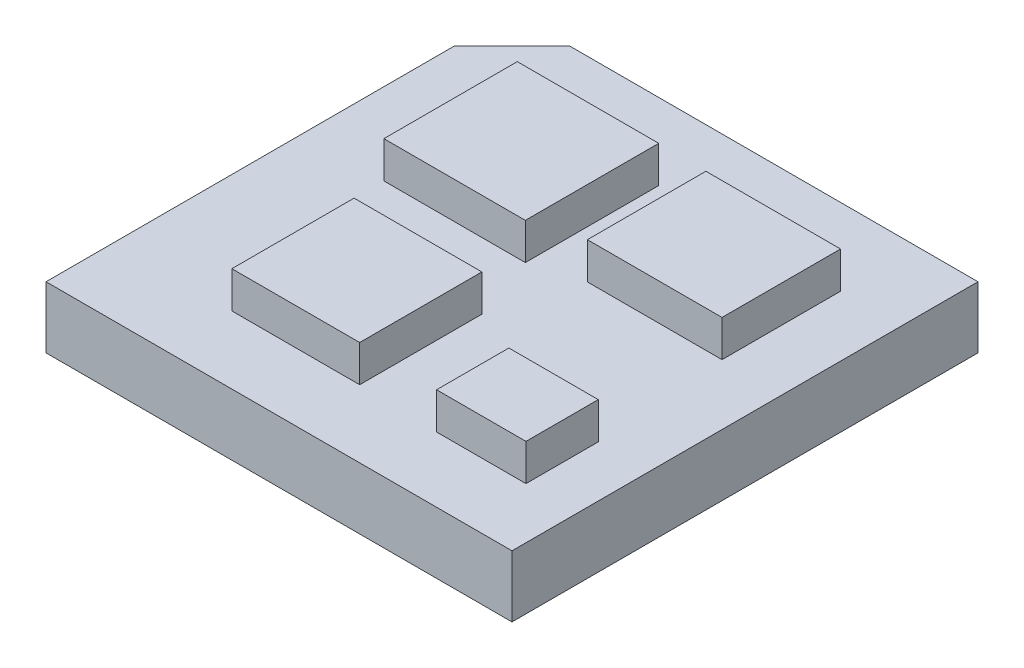
ISO-10303-21;
HEADER;
FILE_DESCRIPTION(('STEP AP214'),'2;1');
FILE_NAME('part.step','',(''),(''),'','','');
FILE_SCHEMA(('AUTOMOTIVE_DESIGN { 1 0 10303 214 1 1 1 1 }'));
ENDSEC;
DATA;
#1=APPLICATION_CONTEXT('core data for automotive mechanical design processes');
#2=APPLICATION_PROTOCOL_DEFINITION('international standard','automotive_design',2000,#1);
#3=PRODUCT_CONTEXT('',#1,'mechanical');
#4=PRODUCT('Part','Part','',(#3));
#5=PRODUCT_RELATED_PRODUCT_CATEGORY('part','',(#4));
#6=PRODUCT_DEFINITION_FORMATION('','',#4);
#7=PRODUCT_DEFINITION_CONTEXT('part definition',#1,'design');
#8=PRODUCT_DEFINITION('design','',#6,#7);
#9=PRODUCT_DEFINITION_SHAPE('','',#8);
#10=(LENGTH_UNIT() NAMED_UNIT(*) SI_UNIT(.MILLI.,.METRE.));
#11=(NAMED_UNIT(*) PLANE_ANGLE_UNIT() SI_UNIT($,.RADIAN.));
#12=(NAMED_UNIT(*) SI_UNIT($,.STERADIAN.) SOLID_ANGLE_UNIT());
#13=UNCERTAINTY_MEASURE_WITH_UNIT(LENGTH_MEASURE(1.E-05),#10,'distance_accuracy_value','');
#14=(GEOMETRIC_REPRESENTATION_CONTEXT(3) GLOBAL_UNCERTAINTY_ASSIGNED_CONTEXT((#13)) GLOBAL_UNIT_ASSIGNED_CONTEXT((#10,
#11,#12)) REPRESENTATION_CONTEXT('',''));
#15=CARTESIAN_POINT('',(0.,0.,0.));
#16=DIRECTION('',(0.,0.,1.));
#17=DIRECTION('',(1.,0.,0.));
#18=AXIS2_PLACEMENT_3D('',#15,#16,#17);
#19=CARTESIAN_POINT('',(0.,1.6,0.));
#20=DIRECTION('',(0.,-1.,0.));
#21=DIRECTION('',(0.,0.,-1.));
#22=AXIS2_PLACEMENT_3D('',#19,#20,#21);
#23=PLANE('',#22);
#24=DIRECTION('',(0.,0.,1.));
#25=VECTOR('',#24,1.);
#26=CARTESIAN_POINT('',(7.03277413815735,1.6,-10.1019294384684));
#27=LINE('',#26,#25);
#28=CARTESIAN_POINT('',(7.03277413815735,1.6,-10.1019294384684));
#29=VERTEX_POINT('',#28);
#30=CARTESIAN_POINT('',(7.03277413815735,1.6,-7.02471861243476));
#31=VERTEX_POINT('',#30);
#32=EDGE_CURVE('E196',#29,#31,#27,.T.);
#33=ORIENTED_EDGE('',*,*,#32,.F.);
#34=DIRECTION('',(-1.,0.,0.));
#35=VECTOR('',#34,1.);
#36=CARTESIAN_POINT('',(7.03277413815735,1.6,-10.1019294384684));
#37=LINE('',#36,#35);
#38=CARTESIAN_POINT('',(10.5288723017663,1.6,-10.1019294384684));
#39=VERTEX_POINT('',#38);
#40=EDGE_CURVE('E209',#39,#29,#37,.T.);
#41=ORIENTED_EDGE('',*,*,#40,.F.);
#42=DIRECTION('',(0.,0.,-1.));
#43=VECTOR('',#42,1.);
#44=CARTESIAN_POINT('',(10.5288723017663,1.6,-10.1019294384684));
#45=LINE('',#44,#43);
#46=CARTESIAN_POINT('',(10.5288723017663,1.6,-7.02471861243476));
#47=VERTEX_POINT('',#46);
#48=EDGE_CURVE('E218',#47,#39,#45,.T.);
#49=ORIENTED_EDGE('',*,*,#48,.F.);
#50=DIRECTION('',(1.,0.,0.));
#51=VECTOR('',#50,1.);
#52=CARTESIAN_POINT('',(7.03277413815735,1.6,-7.02471861243476));
#53=LINE('',#52,#51);
#54=EDGE_CURVE('E199',#31,#47,#53,.T.);
#55=ORIENTED_EDGE('',*,*,#54,.F.);
#56=EDGE_LOOP('',(#33,#41,#49,#55));
#57=FACE_BOUND('',#56,.T.);
#58=DIRECTION('',(0.,0.,1.));
#59=VECTOR('',#58,1.);
#60=CARTESIAN_POINT('',(2.11890344737059,1.6,-10.1180404899136));
#61=LINE('',#60,#59);
#62=CARTESIAN_POINT('',(2.11890344737059,1.6,-10.1180404899136));
#63=VERTEX_POINT('',#62);
#64=CARTESIAN_POINT('',(2.11890344737059,1.6,-6.6541644291951));
#65=VERTEX_POINT('',#64);
#66=EDGE_CURVE('E267',#63,#65,#61,.T.);
#67=ORIENTED_EDGE('',*,*,#66,.F.);
#68=DIRECTION('',(-1.,0.,0.));
#69=VECTOR('',#68,1.);
#70=CARTESIAN_POINT('',(2.11890344737059,1.6,-10.1180404899136));
#71=LINE('',#70,#69);
#72=CARTESIAN_POINT('',(5.79222317687676,1.6,-10.1180404899136));
#73=VERTEX_POINT('',#72);
#74=EDGE_CURVE('E272',#73,#63,#71,.T.);
#75=ORIENTED_EDGE('',*,*,#74,.F.);
#76=DIRECTION('',(0.,0.,-1.));
#77=VECTOR('',#76,1.);
#78=CARTESIAN_POINT('',(5.79222317687676,1.6,-10.1180404899136));
#79=LINE('',#78,#77);
#80=CARTESIAN_POINT('',(5.79222317687676,1.6,-6.6541644291951));
#81=VERTEX_POINT('',#80);
#82=EDGE_CURVE('E284',#81,#73,#79,.T.);
#83=ORIENTED_EDGE('',*,*,#82,.F.);
#84=DIRECTION('',(1.,0.,0.));
#85=VECTOR('',#84,1.);
#86=CARTESIAN_POINT('',(2.11890344737059,1.6,-6.6541644291951));
#87=LINE('',#86,#85);
#88=EDGE_CURVE('E281',#65,#81,#87,.T.);
#89=ORIENTED_EDGE('',*,*,#88,.F.);
#90=EDGE_LOOP('',(#67,#75,#83,#89));
#91=FACE_BOUND('',#90,.T.);
#92=DIRECTION('',(0.,0.,1.));
#93=VECTOR('',#92,1.);
#94=CARTESIAN_POINT('',(0.,1.6,0.));
#95=LINE('',#94,#93);
#96=CARTESIAN_POINT('',(0.,1.6,-10.6));
#97=VERTEX_POINT('',#96);
#98=CARTESIAN_POINT('',(0.,1.6,0.));
#99=VERTEX_POINT('',#98);
#100=EDGE_CURVE('E301',#97,#99,#95,.T.);
#101=ORIENTED_EDGE('',*,*,#100,.T.);
#102=DIRECTION('',(1.,0.,0.));
#103=VECTOR('',#102,1.);
#104=CARTESIAN_POINT('',(0.,1.6,0.));
#105=LINE('',#104,#103);
#106=CARTESIAN_POINT('',(12.1,1.6,0.));
#107=VERTEX_POINT('',#106);
#108=EDGE_CURVE('E304',#99,#107,#105,.T.);
#109=ORIENTED_EDGE('',*,*,#108,.T.);
#110=DIRECTION('',(0.,0.,-1.));
#111=VECTOR('',#110,1.);
#112=CARTESIAN_POINT('',(12.1,1.6,0.));
#113=LINE('',#112,#111);
#114=CARTESIAN_POINT('',(12.1,1.6,-12.1));
#115=VERTEX_POINT('',#114);
#116=EDGE_CURVE('E307',#107,#115,#113,.T.);
#117=ORIENTED_EDGE('',*,*,#116,.T.);
#118=DIRECTION('',(-1.,0.,0.));
#119=VECTOR('',#118,1.);
#120=CARTESIAN_POINT('',(1.5,1.6,-12.1));
#121=LINE('',#120,#119);
#122=CARTESIAN_POINT('',(1.5,1.6,-12.1));
#123=VERTEX_POINT('',#122);
#124=EDGE_CURVE('E309',#115,#123,#121,.T.);
#125=ORIENTED_EDGE('',*,*,#124,.T.);
#126=DIRECTION('',(-0.707106781186548,0.,0.707106781186548));
#127=VECTOR('',#126,1.);
#128=CARTESIAN_POINT('',(0.,1.6,-10.6));
#129=LINE('',#128,#127);
#130=EDGE_CURVE('E311',#123,#97,#129,.T.);
#131=ORIENTED_EDGE('',*,*,#130,.T.);
#132=EDGE_LOOP('',(#101,#109,#117,#125,#131));
#133=FACE_BOUND('',#132,.T.);
#134=DIRECTION('',(0.,0.,1.));
#135=VECTOR('',#134,1.);
#136=CARTESIAN_POINT('',(3.06945548263753,1.6,-4.93028192455843));
#137=LINE('',#136,#135);
#138=CARTESIAN_POINT('',(3.06945548263753,1.6,-4.93028192455843));
#139=VERTEX_POINT('',#138);
#140=CARTESIAN_POINT('',(3.06945548263753,1.6,-1.75640478985353));
#141=VERTEX_POINT('',#140);
#142=EDGE_CURVE('E234',#139,#141,#137,.T.);
#143=ORIENTED_EDGE('',*,*,#142,.F.);
#144=DIRECTION('',(-1.,0.,0.));
#145=VECTOR('',#144,1.);
#146=CARTESIAN_POINT('',(3.06945548263753,1.6,-4.93028192455843));
#147=LINE('',#146,#145);
#148=CARTESIAN_POINT('',(6.38833208034925,1.6,-4.93028192455843));
#149=VERTEX_POINT('',#148);
#150=EDGE_CURVE('E239',#149,#139,#147,.T.);
#151=ORIENTED_EDGE('',*,*,#150,.F.);
#152=DIRECTION('',(0.,0.,-1.));
#153=VECTOR('',#152,1.);
#154=CARTESIAN_POINT('',(6.38833208034925,1.6,-4.93028192455843));
#155=LINE('',#154,#153);
#156=CARTESIAN_POINT('',(6.38833208034925,1.6,-1.75640478985353));
#157=VERTEX_POINT('',#156);
#158=EDGE_CURVE('E251',#157,#149,#155,.T.);
#159=ORIENTED_EDGE('',*,*,#158,.F.);
#160=DIRECTION('',(1.,0.,0.));
#161=VECTOR('',#160,1.);
#162=CARTESIAN_POINT('',(3.06945548263753,1.6,-1.75640478985353));
#163=LINE('',#162,#161);
#164=EDGE_CURVE('E248',#141,#157,#163,.T.);
#165=ORIENTED_EDGE('',*,*,#164,.F.);
#166=EDGE_LOOP('',(#143,#151,#159,#165));
#167=FACE_BOUND('',#166,.T.);
#168=DIRECTION('',(0.,0.,1.));
#169=VECTOR('',#168,1.);
#170=CARTESIAN_POINT('',(8.44944836683226,1.6,-3.56959687638891));
#171=LINE('',#170,#169);
#172=CARTESIAN_POINT('',(8.44944836683226,1.6,-3.56959687638891));
#173=VERTEX_POINT('',#172);
#174=CARTESIAN_POINT('',(8.44944836683226,1.6,-1.69196058407272));
#175=VERTEX_POINT('',#174);
#176=EDGE_CURVE('E195',#173,#175,#171,.T.);
#177=ORIENTED_EDGE('',*,*,#176,.F.);
#178=DIRECTION('',(-1.,0.,0.));
#179=VECTOR('',#178,1.);
#180=CARTESIAN_POINT('',(8.44944836683226,1.6,-3.56959687638891));
#181=LINE('',#180,#179);
#182=CARTESIAN_POINT('',(10.7705380734443,1.6,-3.56959687638891));
#183=VERTEX_POINT('',#182);
#184=EDGE_CURVE('E192',#183,#173,#181,.T.);
#185=ORIENTED_EDGE('',*,*,#184,.F.);
#186=DIRECTION('',(0.,0.,-1.));
#187=VECTOR('',#186,1.);
#188=CARTESIAN_POINT('',(10.7705380734443,1.6,-3.56959687638891));
#189=LINE('',#188,#187);
#190=CARTESIAN_POINT('',(10.7705380734443,1.6,-1.69196058407272));
#191=VERTEX_POINT('',#190);
#192=EDGE_CURVE('E52',#191,#183,#189,.T.);
#193=ORIENTED_EDGE('',*,*,#192,.F.);
#194=DIRECTION('',(1.,0.,0.));
#195=VECTOR('',#194,1.);
#196=CARTESIAN_POINT('',(8.44944836683226,1.6,-1.69196058407272));
#197=LINE('',#196,#195);
#198=EDGE_CURVE('E47',#175,#191,#197,.T.);
#199=ORIENTED_EDGE('',*,*,#198,.F.);
#200=EDGE_LOOP('',(#177,#185,#193,#199));
#201=FACE_BOUND('',#200,.T.);
#202=ADVANCED_FACE('F32',(#57,#91,#133,#167,#201),#23,.F.);
#203=CARTESIAN_POINT('',(0.,1.6,0.));
#204=DIRECTION('',(1.,0.,0.));
#205=DIRECTION('',(0.,0.,-1.));
#206=AXIS2_PLACEMENT_3D('',#203,#204,#205);
#207=PLANE('',#206);
#208=DIRECTION('',(0.,0.,1.));
#209=VECTOR('',#208,1.);
#210=CARTESIAN_POINT('',(0.,0.,0.));
#211=LINE('',#210,#209);
#212=CARTESIAN_POINT('',(0.,0.,-10.6));
#213=VERTEX_POINT('',#212);
#214=CARTESIAN_POINT('',(0.,0.,0.));
#215=VERTEX_POINT('',#214);
#216=EDGE_CURVE('E300',#213,#215,#211,.T.);
#217=ORIENTED_EDGE('',*,*,#216,.T.);
#218=DIRECTION('',(0.,-1.,0.));
#219=VECTOR('',#218,1.);
#220=CARTESIAN_POINT('',(0.,1.6,0.));
#221=LINE('',#220,#219);
#222=EDGE_CURVE('E11',#99,#215,#221,.T.);
#223=ORIENTED_EDGE('',*,*,#222,.F.);
#224=ORIENTED_EDGE('',*,*,#100,.F.);
#225=DIRECTION('',(0.,-1.,0.));
#226=VECTOR('',#225,1.);
#227=CARTESIAN_POINT('',(0.,1.6,-10.6));
#228=LINE('',#227,#226);
#229=EDGE_CURVE('E313',#97,#213,#228,.T.);
#230=ORIENTED_EDGE('',*,*,#229,.T.);
#231=EDGE_LOOP('',(#217,#223,#224,#230));
#232=FACE_BOUND('',#231,.T.);
#233=ADVANCED_FACE('F34',(#232),#207,.F.);
#234=CARTESIAN_POINT('',(0.,1.6,0.));
#235=DIRECTION('',(0.,0.,-1.));
#236=DIRECTION('',(-1.,0.,0.));
#237=AXIS2_PLACEMENT_3D('',#234,#235,#236);
#238=PLANE('',#237);
#239=DIRECTION('',(1.,0.,0.));
#240=VECTOR('',#239,1.);
#241=CARTESIAN_POINT('',(0.,0.,0.));
#242=LINE('',#241,#240);
#243=CARTESIAN_POINT('',(12.1,0.,0.));
#244=VERTEX_POINT('',#243);
#245=EDGE_CURVE('E316',#215,#244,#242,.T.);
#246=ORIENTED_EDGE('',*,*,#245,.T.);
#247=DIRECTION('',(0.,-1.,0.));
#248=VECTOR('',#247,1.);
#249=CARTESIAN_POINT('',(12.1,1.6,0.));
#250=LINE('',#249,#248);
#251=EDGE_CURVE('E40',#107,#244,#250,.T.);
#252=ORIENTED_EDGE('',*,*,#251,.F.);
#253=ORIENTED_EDGE('',*,*,#108,.F.);
#254=ORIENTED_EDGE('',*,*,#222,.T.);
#255=EDGE_LOOP('',(#246,#252,#253,#254));
#256=FACE_BOUND('',#255,.T.);
#257=ADVANCED_FACE('F355',(#256),#238,.F.);
#258=CARTESIAN_POINT('',(12.1,1.6,0.));
#259=DIRECTION('',(-1.,0.,0.));
#260=DIRECTION('',(0.,0.,1.));
#261=AXIS2_PLACEMENT_3D('',#258,#259,#260);
#262=PLANE('',#261);
#263=DIRECTION('',(0.,0.,-1.));
#264=VECTOR('',#263,1.);
#265=CARTESIAN_POINT('',(12.1,0.,0.));
#266=LINE('',#265,#264);
#267=CARTESIAN_POINT('',(12.1,0.,-12.1));
#268=VERTEX_POINT('',#267);
#269=EDGE_CURVE('E318',#244,#268,#266,.T.);
#270=ORIENTED_EDGE('',*,*,#269,.T.);
#271=DIRECTION('',(0.,-1.,0.));
#272=VECTOR('',#271,1.);
#273=CARTESIAN_POINT('',(12.1,1.6,-12.1));
#274=LINE('',#273,#272);
#275=EDGE_CURVE('E328',#115,#268,#274,.T.);
#276=ORIENTED_EDGE('',*,*,#275,.F.);
#277=ORIENTED_EDGE('',*,*,#116,.F.);
#278=ORIENTED_EDGE('',*,*,#251,.T.);
#279=EDGE_LOOP('',(#270,#276,#277,#278));
#280=FACE_BOUND('',#279,.T.);
#281=ADVANCED_FACE('F335',(#280),#262,.F.);
#282=CARTESIAN_POINT('',(1.5,1.6,-12.1));
#283=DIRECTION('',(0.,0.,1.));
#284=DIRECTION('',(1.,0.,0.));
#285=AXIS2_PLACEMENT_3D('',#282,#283,#284);
#286=PLANE('',#285);
#287=DIRECTION('',(-1.,0.,0.));
#288=VECTOR('',#287,1.);
#289=CARTESIAN_POINT('',(1.5,0.,-12.1));
#290=LINE('',#289,#288);
#291=CARTESIAN_POINT('',(1.5,0.,-12.1));
#292=VERTEX_POINT('',#291);
#293=EDGE_CURVE('E320',#268,#292,#290,.T.);
#294=ORIENTED_EDGE('',*,*,#293,.T.);
#295=DIRECTION('',(0.,-1.,0.));
#296=VECTOR('',#295,1.);
#297=CARTESIAN_POINT('',(1.5,1.6,-12.1));
#298=LINE('',#297,#296);
#299=EDGE_CURVE('E325',#123,#292,#298,.T.);
#300=ORIENTED_EDGE('',*,*,#299,.F.);
#301=ORIENTED_EDGE('',*,*,#124,.F.);
#302=ORIENTED_EDGE('',*,*,#275,.T.);
#303=EDGE_LOOP('',(#294,#300,#301,#302));
#304=FACE_BOUND('',#303,.T.);
#305=ADVANCED_FACE('F345',(#304),#286,.F.);
#306=CARTESIAN_POINT('',(0.,1.6,-10.6));
#307=DIRECTION('',(0.707106781186548,0.,0.707106781186548));
#308=DIRECTION('',(0.707106781186548,0.,-0.707106781186548));
#309=AXIS2_PLACEMENT_3D('',#306,#307,#308);
#310=PLANE('',#309);
#311=DIRECTION('',(-0.707106781186548,0.,0.707106781186548));
#312=VECTOR('',#311,1.);
#313=CARTESIAN_POINT('',(0.,0.,-10.6));
#314=LINE('',#313,#312);
#315=EDGE_CURVE('E305',#292,#213,#314,.T.);
#316=ORIENTED_EDGE('',*,*,#315,.T.);
#317=ORIENTED_EDGE('',*,*,#229,.F.);
#318=ORIENTED_EDGE('',*,*,#130,.F.);
#319=ORIENTED_EDGE('',*,*,#299,.T.);
#320=EDGE_LOOP('',(#316,#317,#318,#319));
#321=FACE_BOUND('',#320,.T.);
#322=ADVANCED_FACE('F349',(#321),#310,.F.);
#323=CARTESIAN_POINT('',(0.,0.,0.));
#324=DIRECTION('',(0.,-1.,0.));
#325=DIRECTION('',(0.,0.,-1.));
#326=AXIS2_PLACEMENT_3D('',#323,#324,#325);
#327=PLANE('',#326);
#328=ORIENTED_EDGE('',*,*,#216,.F.);
#329=ORIENTED_EDGE('',*,*,#315,.F.);
#330=ORIENTED_EDGE('',*,*,#293,.F.);
#331=ORIENTED_EDGE('',*,*,#269,.F.);
#332=ORIENTED_EDGE('',*,*,#245,.F.);
#333=EDGE_LOOP('',(#328,#329,#330,#331,#332));
#334=FACE_BOUND('',#333,.T.);
#335=ADVANCED_FACE('F341',(#334),#327,.T.);
#336=CARTESIAN_POINT('',(2.11890344737059,2.55,-10.1180404899136));
#337=DIRECTION('',(1.,0.,0.));
#338=DIRECTION('',(0.,0.,-1.));
#339=AXIS2_PLACEMENT_3D('',#336,#337,#338);
#340=PLANE('',#339);
#341=ORIENTED_EDGE('',*,*,#66,.T.);
#342=DIRECTION('',(0.,-1.,0.));
#343=VECTOR('',#342,1.);
#344=CARTESIAN_POINT('',(2.11890344737059,2.55,-6.6541644291951));
#345=LINE('',#344,#343);
#346=CARTESIAN_POINT('',(2.11890344737059,2.55,-6.6541644291951));
#347=VERTEX_POINT('',#346);
#348=EDGE_CURVE('E297',#347,#65,#345,.T.);
#349=ORIENTED_EDGE('',*,*,#348,.F.);
#350=DIRECTION('',(0.,0.,1.));
#351=VECTOR('',#350,1.);
#352=CARTESIAN_POINT('',(2.11890344737059,2.55,-10.1180404899136));
#353=LINE('',#352,#351);
#354=CARTESIAN_POINT('',(2.11890344737059,2.55,-10.1180404899136));
#355=VERTEX_POINT('',#354);
#356=EDGE_CURVE('E268',#355,#347,#353,.T.);
#357=ORIENTED_EDGE('',*,*,#356,.F.);
#358=DIRECTION('',(0.,-1.,0.));
#359=VECTOR('',#358,1.);
#360=CARTESIAN_POINT('',(2.11890344737059,2.55,-10.1180404899136));
#361=LINE('',#360,#359);
#362=EDGE_CURVE('E278',#355,#63,#361,.T.);
#363=ORIENTED_EDGE('',*,*,#362,.T.);
#364=EDGE_LOOP('',(#341,#349,#357,#363));
#365=FACE_BOUND('',#364,.T.);
#366=ADVANCED_FACE('F369',(#365),#340,.F.);
#367=CARTESIAN_POINT('',(2.11890344737059,2.55,-6.6541644291951));
#368=DIRECTION('',(0.,0.,-1.));
#369=DIRECTION('',(-1.,0.,0.));
#370=AXIS2_PLACEMENT_3D('',#367,#368,#369);
#371=PLANE('',#370);
#372=ORIENTED_EDGE('',*,*,#88,.T.);
#373=DIRECTION('',(0.,-1.,0.));
#374=VECTOR('',#373,1.);
#375=CARTESIAN_POINT('',(5.79222317687676,2.55,-6.6541644291951));
#376=LINE('',#375,#374);
#377=CARTESIAN_POINT('',(5.79222317687676,2.55,-6.6541644291951));
#378=VERTEX_POINT('',#377);
#379=EDGE_CURVE('E294',#378,#81,#376,.T.);
#380=ORIENTED_EDGE('',*,*,#379,.F.);
#381=DIRECTION('',(1.,0.,0.));
#382=VECTOR('',#381,1.);
#383=CARTESIAN_POINT('',(2.11890344737059,2.55,-6.6541644291951));
#384=LINE('',#383,#382);
#385=EDGE_CURVE('E271',#347,#378,#384,.T.);
#386=ORIENTED_EDGE('',*,*,#385,.F.);
#387=ORIENTED_EDGE('',*,*,#348,.T.);
#388=EDGE_LOOP('',(#372,#380,#386,#387));
#389=FACE_BOUND('',#388,.T.);
#390=ADVANCED_FACE('F400',(#389),#371,.F.);
#391=CARTESIAN_POINT('',(5.79222317687676,2.55,-10.1180404899136));
#392=DIRECTION('',(-1.,0.,0.));
#393=DIRECTION('',(0.,0.,1.));
#394=AXIS2_PLACEMENT_3D('',#391,#392,#393);
#395=PLANE('',#394);
#396=ORIENTED_EDGE('',*,*,#82,.T.);
#397=DIRECTION('',(0.,-1.,0.));
#398=VECTOR('',#397,1.);
#399=CARTESIAN_POINT('',(5.79222317687676,2.55,-10.1180404899136));
#400=LINE('',#399,#398);
#401=CARTESIAN_POINT('',(5.79222317687676,2.55,-10.1180404899136));
#402=VERTEX_POINT('',#401);
#403=EDGE_CURVE('E291',#402,#73,#400,.T.);
#404=ORIENTED_EDGE('',*,*,#403,.F.);
#405=DIRECTION('',(0.,0.,-1.));
#406=VECTOR('',#405,1.);
#407=CARTESIAN_POINT('',(5.79222317687676,2.55,-10.1180404899136));
#408=LINE('',#407,#406);
#409=EDGE_CURVE('E274',#378,#402,#408,.T.);
#410=ORIENTED_EDGE('',*,*,#409,.F.);
#411=ORIENTED_EDGE('',*,*,#379,.T.);
#412=EDGE_LOOP('',(#396,#404,#410,#411));
#413=FACE_BOUND('',#412,.T.);
#414=ADVANCED_FACE('F407',(#413),#395,.F.);
#415=CARTESIAN_POINT('',(2.11890344737059,2.55,-10.1180404899136));
#416=DIRECTION('',(0.,0.,1.));
#417=DIRECTION('',(1.,0.,0.));
#418=AXIS2_PLACEMENT_3D('',#415,#416,#417);
#419=PLANE('',#418);
#420=ORIENTED_EDGE('',*,*,#74,.T.);
#421=ORIENTED_EDGE('',*,*,#362,.F.);
#422=DIRECTION('',(-1.,0.,0.));
#423=VECTOR('',#422,1.);
#424=CARTESIAN_POINT('',(2.11890344737059,2.55,-10.1180404899136));
#425=LINE('',#424,#423);
#426=EDGE_CURVE('E276',#402,#355,#425,.T.);
#427=ORIENTED_EDGE('',*,*,#426,.F.);
#428=ORIENTED_EDGE('',*,*,#403,.T.);
#429=EDGE_LOOP('',(#420,#421,#427,#428));
#430=FACE_BOUND('',#429,.T.);
#431=ADVANCED_FACE('F414',(#430),#419,.F.);
#432=CARTESIAN_POINT('',(0.,2.55,0.));
#433=DIRECTION('',(0.,1.,0.));
#434=DIRECTION('',(0.,0.,1.));
#435=AXIS2_PLACEMENT_3D('',#432,#433,#434);
#436=PLANE('',#435);
#437=ORIENTED_EDGE('',*,*,#356,.T.);
#438=ORIENTED_EDGE('',*,*,#385,.T.);
#439=ORIENTED_EDGE('',*,*,#409,.T.);
#440=ORIENTED_EDGE('',*,*,#426,.T.);
#441=EDGE_LOOP('',(#437,#438,#439,#440));
#442=FACE_BOUND('',#441,.T.);
#443=ADVANCED_FACE('F422',(#442),#436,.T.);
#444=CARTESIAN_POINT('',(3.06945548263753,2.55,-4.93028192455843));
#445=DIRECTION('',(1.,0.,0.));
#446=DIRECTION('',(0.,0.,-1.));
#447=AXIS2_PLACEMENT_3D('',#444,#445,#446);
#448=PLANE('',#447);
#449=ORIENTED_EDGE('',*,*,#142,.T.);
#450=DIRECTION('',(0.,-1.,0.));
#451=VECTOR('',#450,1.);
#452=CARTESIAN_POINT('',(3.06945548263753,2.55,-1.75640478985353));
#453=LINE('',#452,#451);
#454=CARTESIAN_POINT('',(3.06945548263753,2.55,-1.75640478985353));
#455=VERTEX_POINT('',#454);
#456=EDGE_CURVE('E264',#455,#141,#453,.T.);
#457=ORIENTED_EDGE('',*,*,#456,.F.);
#458=DIRECTION('',(0.,0.,1.));
#459=VECTOR('',#458,1.);
#460=CARTESIAN_POINT('',(3.06945548263753,2.55,-4.93028192455843));
#461=LINE('',#460,#459);
#462=CARTESIAN_POINT('',(3.06945548263753,2.55,-4.93028192455843));
#463=VERTEX_POINT('',#462);
#464=EDGE_CURVE('E235',#463,#455,#461,.T.);
#465=ORIENTED_EDGE('',*,*,#464,.F.);
#466=DIRECTION('',(0.,-1.,0.));
#467=VECTOR('',#466,1.);
#468=CARTESIAN_POINT('',(3.06945548263753,2.55,-4.93028192455843));
#469=LINE('',#468,#467);
#470=EDGE_CURVE('E245',#463,#139,#469,.T.);
#471=ORIENTED_EDGE('',*,*,#470,.T.);
#472=EDGE_LOOP('',(#449,#457,#465,#471));
#473=FACE_BOUND('',#472,.T.);
#474=ADVANCED_FACE('F430',(#473),#448,.F.);
#475=CARTESIAN_POINT('',(3.06945548263753,2.55,-1.75640478985353));
#476=DIRECTION('',(0.,0.,-1.));
#477=DIRECTION('',(-1.,0.,0.));
#478=AXIS2_PLACEMENT_3D('',#475,#476,#477);
#479=PLANE('',#478);
#480=ORIENTED_EDGE('',*,*,#164,.T.);
#481=DIRECTION('',(0.,-1.,0.));
#482=VECTOR('',#481,1.);
#483=CARTESIAN_POINT('',(6.38833208034925,2.55,-1.75640478985353));
#484=LINE('',#483,#482);
#485=CARTESIAN_POINT('',(6.38833208034925,2.55,-1.75640478985353));
#486=VERTEX_POINT('',#485);
#487=EDGE_CURVE('E261',#486,#157,#484,.T.);
#488=ORIENTED_EDGE('',*,*,#487,.F.);
#489=DIRECTION('',(1.,0.,0.));
#490=VECTOR('',#489,1.);
#491=CARTESIAN_POINT('',(3.06945548263753,2.55,-1.75640478985353));
#492=LINE('',#491,#490);
#493=EDGE_CURVE('E238',#455,#486,#492,.T.);
#494=ORIENTED_EDGE('',*,*,#493,.F.);
#495=ORIENTED_EDGE('',*,*,#456,.T.);
#496=EDGE_LOOP('',(#480,#488,#494,#495));
#497=FACE_BOUND('',#496,.T.);
#498=ADVANCED_FACE('F438',(#497),#479,.F.);
#499=CARTESIAN_POINT('',(6.38833208034925,2.55,-4.93028192455843));
#500=DIRECTION('',(-1.,0.,0.));
#501=DIRECTION('',(0.,0.,1.));
#502=AXIS2_PLACEMENT_3D('',#499,#500,#501);
#503=PLANE('',#502);
#504=ORIENTED_EDGE('',*,*,#158,.T.);
#505=DIRECTION('',(0.,-1.,0.));
#506=VECTOR('',#505,1.);
#507=CARTESIAN_POINT('',(6.38833208034925,2.55,-4.93028192455843));
#508=LINE('',#507,#506);
#509=CARTESIAN_POINT('',(6.38833208034925,2.55,-4.93028192455843));
#510=VERTEX_POINT('',#509);
#511=EDGE_CURVE('E258',#510,#149,#508,.T.);
#512=ORIENTED_EDGE('',*,*,#511,.F.);
#513=DIRECTION('',(0.,0.,-1.));
#514=VECTOR('',#513,1.);
#515=CARTESIAN_POINT('',(6.38833208034925,2.55,-4.93028192455843));
#516=LINE('',#515,#514);
#517=EDGE_CURVE('E241',#486,#510,#516,.T.);
#518=ORIENTED_EDGE('',*,*,#517,.F.);
#519=ORIENTED_EDGE('',*,*,#487,.T.);
#520=EDGE_LOOP('',(#504,#512,#518,#519));
#521=FACE_BOUND('',#520,.T.);
#522=ADVANCED_FACE('F446',(#521),#503,.F.);
#523=CARTESIAN_POINT('',(3.06945548263753,2.55,-4.93028192455843));
#524=DIRECTION('',(0.,0.,1.));
#525=DIRECTION('',(1.,0.,0.));
#526=AXIS2_PLACEMENT_3D('',#523,#524,#525);
#527=PLANE('',#526);
#528=ORIENTED_EDGE('',*,*,#150,.T.);
#529=ORIENTED_EDGE('',*,*,#470,.F.);
#530=DIRECTION('',(-1.,0.,0.));
#531=VECTOR('',#530,1.);
#532=CARTESIAN_POINT('',(3.06945548263753,2.55,-4.93028192455843));
#533=LINE('',#532,#531);
#534=EDGE_CURVE('E243',#510,#463,#533,.T.);
#535=ORIENTED_EDGE('',*,*,#534,.F.);
#536=ORIENTED_EDGE('',*,*,#511,.T.);
#537=EDGE_LOOP('',(#528,#529,#535,#536));
#538=FACE_BOUND('',#537,.T.);
#539=ADVANCED_FACE('F454',(#538),#527,.F.);
#540=CARTESIAN_POINT('',(0.,2.55,0.));
#541=DIRECTION('',(0.,1.,0.));
#542=DIRECTION('',(0.,0.,1.));
#543=AXIS2_PLACEMENT_3D('',#540,#541,#542);
#544=PLANE('',#543);
#545=ORIENTED_EDGE('',*,*,#464,.T.);
#546=ORIENTED_EDGE('',*,*,#493,.T.);
#547=ORIENTED_EDGE('',*,*,#517,.T.);
#548=ORIENTED_EDGE('',*,*,#534,.T.);
#549=EDGE_LOOP('',(#545,#546,#547,#548));
#550=FACE_BOUND('',#549,.T.);
#551=ADVANCED_FACE('F462',(#550),#544,.T.);
#552=CARTESIAN_POINT('',(7.03277413815735,2.55,-10.1019294384684));
#553=DIRECTION('',(1.,0.,0.));
#554=DIRECTION('',(0.,0.,-1.));
#555=AXIS2_PLACEMENT_3D('',#552,#553,#554);
#556=PLANE('',#555);
#557=ORIENTED_EDGE('',*,*,#32,.T.);
#558=DIRECTION('',(0.,-1.,0.));
#559=VECTOR('',#558,1.);
#560=CARTESIAN_POINT('',(7.03277413815735,2.55,-7.02471861243476));
#561=LINE('',#560,#559);
#562=CARTESIAN_POINT('',(7.03277413815735,2.55,-7.02471861243476));
#563=VERTEX_POINT('',#562);
#564=EDGE_CURVE('E231',#563,#31,#561,.T.);
#565=ORIENTED_EDGE('',*,*,#564,.F.);
#566=DIRECTION('',(0.,0.,1.));
#567=VECTOR('',#566,1.);
#568=CARTESIAN_POINT('',(7.03277413815735,2.55,-10.1019294384684));
#569=LINE('',#568,#567);
#570=CARTESIAN_POINT('',(7.03277413815735,2.55,-10.1019294384684));
#571=VERTEX_POINT('',#570);
#572=EDGE_CURVE('E205',#571,#563,#569,.T.);
#573=ORIENTED_EDGE('',*,*,#572,.F.);
#574=DIRECTION('',(0.,-1.,0.));
#575=VECTOR('',#574,1.);
#576=CARTESIAN_POINT('',(7.03277413815735,2.55,-10.1019294384684));
#577=LINE('',#576,#575);
#578=EDGE_CURVE('E214',#571,#29,#577,.T.);
#579=ORIENTED_EDGE('',*,*,#578,.T.);
#580=EDGE_LOOP('',(#557,#565,#573,#579));
#581=FACE_BOUND('',#580,.T.);
#582=ADVANCED_FACE('F470',(#581),#556,.F.);
#583=CARTESIAN_POINT('',(7.03277413815735,2.55,-7.02471861243476));
#584=DIRECTION('',(0.,0.,-1.));
#585=DIRECTION('',(-1.,0.,0.));
#586=AXIS2_PLACEMENT_3D('',#583,#584,#585);
#587=PLANE('',#586);
#588=ORIENTED_EDGE('',*,*,#54,.T.);
#589=DIRECTION('',(0.,-1.,0.));
#590=VECTOR('',#589,1.);
#591=CARTESIAN_POINT('',(10.5288723017663,2.55,-7.02471861243476));
#592=LINE('',#591,#590);
#593=CARTESIAN_POINT('',(10.5288723017663,2.55,-7.02471861243476));
#594=VERTEX_POINT('',#593);
#595=EDGE_CURVE('E228',#594,#47,#592,.T.);
#596=ORIENTED_EDGE('',*,*,#595,.F.);
#597=DIRECTION('',(1.,0.,0.));
#598=VECTOR('',#597,1.);
#599=CARTESIAN_POINT('',(7.03277413815735,2.55,-7.02471861243476));
#600=LINE('',#599,#598);
#601=EDGE_CURVE('E208',#563,#594,#600,.T.);
#602=ORIENTED_EDGE('',*,*,#601,.F.);
#603=ORIENTED_EDGE('',*,*,#564,.T.);
#604=EDGE_LOOP('',(#588,#596,#602,#603));
#605=FACE_BOUND('',#604,.T.);
#606=ADVANCED_FACE('F478',(#605),#587,.F.);
#607=CARTESIAN_POINT('',(10.5288723017663,2.55,-10.1019294384684));
#608=DIRECTION('',(-1.,0.,0.));
#609=DIRECTION('',(0.,0.,1.));
#610=AXIS2_PLACEMENT_3D('',#607,#608,#609);
#611=PLANE('',#610);
#612=ORIENTED_EDGE('',*,*,#48,.T.);
#613=DIRECTION('',(0.,-1.,0.));
#614=VECTOR('',#613,1.);
#615=CARTESIAN_POINT('',(10.5288723017663,2.55,-10.1019294384684));
#616=LINE('',#615,#614);
#617=CARTESIAN_POINT('',(10.5288723017663,2.55,-10.1019294384684));
#618=VERTEX_POINT('',#617);
#619=EDGE_CURVE('E225',#618,#39,#616,.T.);
#620=ORIENTED_EDGE('',*,*,#619,.F.);
#621=DIRECTION('',(0.,0.,-1.));
#622=VECTOR('',#621,1.);
#623=CARTESIAN_POINT('',(10.5288723017663,2.55,-10.1019294384684));
#624=LINE('',#623,#622);
#625=EDGE_CURVE('E211',#594,#618,#624,.T.);
#626=ORIENTED_EDGE('',*,*,#625,.F.);
#627=ORIENTED_EDGE('',*,*,#595,.T.);
#628=EDGE_LOOP('',(#612,#620,#626,#627));
#629=FACE_BOUND('',#628,.T.);
#630=ADVANCED_FACE('F486',(#629),#611,.F.);
#631=CARTESIAN_POINT('',(7.03277413815735,2.55,-10.1019294384684));
#632=DIRECTION('',(0.,0.,1.));
#633=DIRECTION('',(1.,0.,0.));
#634=AXIS2_PLACEMENT_3D('',#631,#632,#633);
#635=PLANE('',#634);
#636=ORIENTED_EDGE('',*,*,#40,.T.);
#637=ORIENTED_EDGE('',*,*,#578,.F.);
#638=DIRECTION('',(-1.,0.,0.));
#639=VECTOR('',#638,1.);
#640=CARTESIAN_POINT('',(7.03277413815735,2.55,-10.1019294384684));
#641=LINE('',#640,#639);
#642=EDGE_CURVE('E213',#618,#571,#641,.T.);
#643=ORIENTED_EDGE('',*,*,#642,.F.);
#644=ORIENTED_EDGE('',*,*,#619,.T.);
#645=EDGE_LOOP('',(#636,#637,#643,#644));
#646=FACE_BOUND('',#645,.T.);
#647=ADVANCED_FACE('F494',(#646),#635,.F.);
#648=CARTESIAN_POINT('',(0.,2.55,0.));
#649=DIRECTION('',(0.,1.,0.));
#650=DIRECTION('',(0.,0.,1.));
#651=AXIS2_PLACEMENT_3D('',#648,#649,#650);
#652=PLANE('',#651);
#653=ORIENTED_EDGE('',*,*,#572,.T.);
#654=ORIENTED_EDGE('',*,*,#601,.T.);
#655=ORIENTED_EDGE('',*,*,#625,.T.);
#656=ORIENTED_EDGE('',*,*,#642,.T.);
#657=EDGE_LOOP('',(#653,#654,#655,#656));
#658=FACE_BOUND('',#657,.T.);
#659=ADVANCED_FACE('F502',(#658),#652,.T.);
#660=CARTESIAN_POINT('',(8.44944836683226,2.55,-3.56959687638891));
#661=DIRECTION('',(1.,0.,0.));
#662=DIRECTION('',(0.,0.,-1.));
#663=AXIS2_PLACEMENT_3D('',#660,#661,#662);
#664=PLANE('',#663);
#665=ORIENTED_EDGE('',*,*,#176,.T.);
#666=DIRECTION('',(0.,-1.,0.));
#667=VECTOR('',#666,1.);
#668=CARTESIAN_POINT('',(8.44944836683226,2.55,-1.69196058407272));
#669=LINE('',#668,#667);
#670=CARTESIAN_POINT('',(8.44944836683226,2.55,-1.69196058407272));
#671=VERTEX_POINT('',#670);
#672=EDGE_CURVE('E176',#671,#175,#669,.T.);
#673=ORIENTED_EDGE('',*,*,#672,.F.);
#674=DIRECTION('',(0.,0.,1.));
#675=VECTOR('',#674,1.);
#676=CARTESIAN_POINT('',(8.44944836683226,2.55,-3.56959687638891));
#677=LINE('',#676,#675);
#678=CARTESIAN_POINT('',(8.44944836683226,2.55,-3.56959687638891));
#679=VERTEX_POINT('',#678);
#680=EDGE_CURVE('E183',#679,#671,#677,.T.);
#681=ORIENTED_EDGE('',*,*,#680,.F.);
#682=DIRECTION('',(0.,-1.,0.));
#683=VECTOR('',#682,1.);
#684=CARTESIAN_POINT('',(8.44944836683226,2.55,-3.56959687638891));
#685=LINE('',#684,#683);
#686=EDGE_CURVE('E609',#679,#173,#685,.T.);
#687=ORIENTED_EDGE('',*,*,#686,.T.);
#688=EDGE_LOOP('',(#665,#673,#681,#687));
#689=FACE_BOUND('',#688,.T.);
#690=ADVANCED_FACE('F194',(#689),#664,.F.);
#691=CARTESIAN_POINT('',(8.44944836683226,2.55,-1.69196058407272));
#692=DIRECTION('',(0.,0.,-1.));
#693=DIRECTION('',(-1.,0.,0.));
#694=AXIS2_PLACEMENT_3D('',#691,#692,#693);
#695=PLANE('',#694);
#696=ORIENTED_EDGE('',*,*,#198,.T.);
#697=DIRECTION('',(0.,-1.,0.));
#698=VECTOR('',#697,1.);
#699=CARTESIAN_POINT('',(10.7705380734443,2.55,-1.69196058407272));
#700=LINE('',#699,#698);
#701=CARTESIAN_POINT('',(10.7705380734443,2.55,-1.69196058407272));
#702=VERTEX_POINT('',#701);
#703=EDGE_CURVE('E179',#702,#191,#700,.T.);
#704=ORIENTED_EDGE('',*,*,#703,.F.);
#705=DIRECTION('',(1.,0.,0.));
#706=VECTOR('',#705,1.);
#707=CARTESIAN_POINT('',(8.44944836683226,2.55,-1.69196058407272));
#708=LINE('',#707,#706);
#709=EDGE_CURVE('E172',#671,#702,#708,.T.);
#710=ORIENTED_EDGE('',*,*,#709,.F.);
#711=ORIENTED_EDGE('',*,*,#672,.T.);
#712=EDGE_LOOP('',(#696,#704,#710,#711));
#713=FACE_BOUND('',#712,.T.);
#714=ADVANCED_FACE('F174',(#713),#695,.F.);
#715=CARTESIAN_POINT('',(10.7705380734443,2.55,-3.56959687638891));
#716=DIRECTION('',(-1.,0.,0.));
#717=DIRECTION('',(0.,0.,1.));
#718=AXIS2_PLACEMENT_3D('',#715,#716,#717);
#719=PLANE('',#718);
#720=ORIENTED_EDGE('',*,*,#192,.T.);
#721=DIRECTION('',(0.,-1.,0.));
#722=VECTOR('',#721,1.);
#723=CARTESIAN_POINT('',(10.7705380734443,2.55,-3.56959687638891));
#724=LINE('',#723,#722);
#725=CARTESIAN_POINT('',(10.7705380734443,2.55,-3.56959687638891));
#726=VERTEX_POINT('',#725);
#727=EDGE_CURVE('E201',#726,#183,#724,.T.);
#728=ORIENTED_EDGE('',*,*,#727,.F.);
#729=DIRECTION('',(0.,0.,-1.));
#730=VECTOR('',#729,1.);
#731=CARTESIAN_POINT('',(10.7705380734443,2.55,-3.56959687638891));
#732=LINE('',#731,#730);
#733=EDGE_CURVE('E182',#702,#726,#732,.T.);
#734=ORIENTED_EDGE('',*,*,#733,.F.);
#735=ORIENTED_EDGE('',*,*,#703,.T.);
#736=EDGE_LOOP('',(#720,#728,#734,#735));
#737=FACE_BOUND('',#736,.T.);
#738=ADVANCED_FACE('F523',(#737),#719,.F.);
#739=CARTESIAN_POINT('',(8.44944836683226,2.55,-3.56959687638891));
#740=DIRECTION('',(0.,0.,1.));
#741=DIRECTION('',(1.,0.,0.));
#742=AXIS2_PLACEMENT_3D('',#739,#740,#741);
#743=PLANE('',#742);
#744=ORIENTED_EDGE('',*,*,#184,.T.);
#745=ORIENTED_EDGE('',*,*,#686,.F.);
#746=DIRECTION('',(-1.,0.,0.));
#747=VECTOR('',#746,1.);
#748=CARTESIAN_POINT('',(8.44944836683226,2.55,-3.56959687638891));
#749=LINE('',#748,#747);
#750=EDGE_CURVE('E188',#726,#679,#749,.T.);
#751=ORIENTED_EDGE('',*,*,#750,.F.);
#752=ORIENTED_EDGE('',*,*,#727,.T.);
#753=EDGE_LOOP('',(#744,#745,#751,#752));
#754=FACE_BOUND('',#753,.T.);
#755=ADVANCED_FACE('F530',(#754),#743,.F.);
#756=CARTESIAN_POINT('',(0.,2.55,0.));
#757=DIRECTION('',(0.,1.,0.));
#758=DIRECTION('',(0.,0.,1.));
#759=AXIS2_PLACEMENT_3D('',#756,#757,#758);
#760=PLANE('',#759);
#761=ORIENTED_EDGE('',*,*,#680,.T.);
#762=ORIENTED_EDGE('',*,*,#709,.T.);
#763=ORIENTED_EDGE('',*,*,#733,.T.);
#764=ORIENTED_EDGE('',*,*,#750,.T.);
#765=EDGE_LOOP('',(#761,#762,#763,#764));
#766=FACE_BOUND('',#765,.T.);
#767=ADVANCED_FACE('F186',(#766),#760,.T.);
#768=CLOSED_SHELL('',(#202,#233,#257,#281,#305,#322,#335,#366,#390,#414,#431,#443,#474,#498,
#522,#539,#551,#582,#606,#630,#647,#659,#690,#714,#738,#755,#767));
#769=MANIFOLD_SOLID_BREP('B2',#768);
#770=ADVANCED_BREP_SHAPE_REPRESENTATION('',(#18,#769),#14);
#771=SHAPE_DEFINITION_REPRESENTATION(#9,#770);
ENDSEC;
END-ISO-10303-21;
